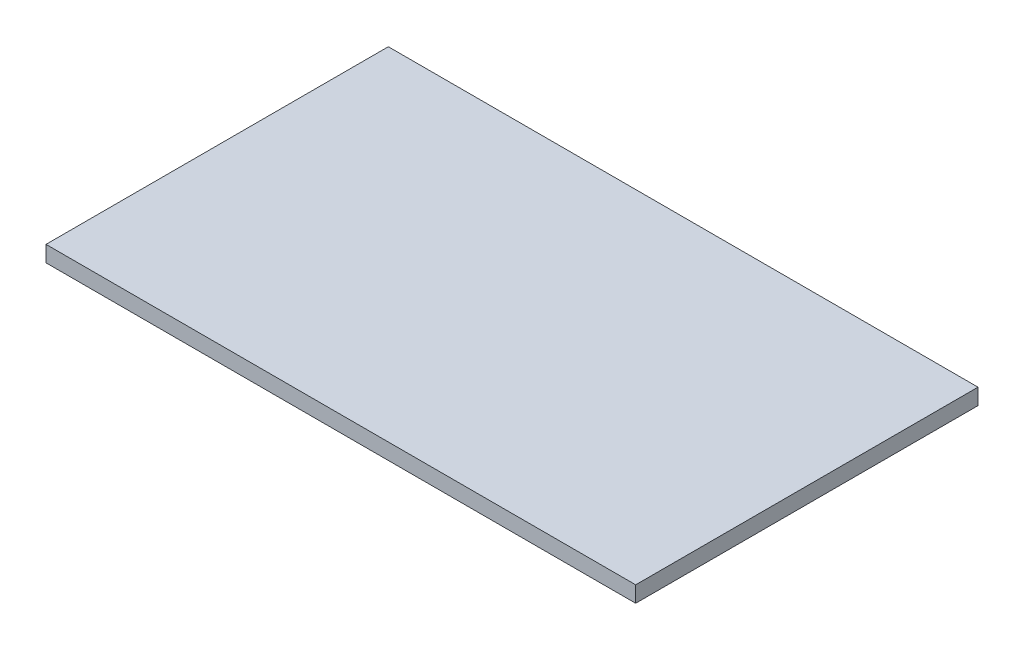
ISO-10303-21;
HEADER;
FILE_DESCRIPTION(('STEP AP214'),'2;1');
FILE_NAME('part.step','',(''),(''),'','','');
FILE_SCHEMA(('AUTOMOTIVE_DESIGN { 1 0 10303 214 1 1 1 1 }'));
ENDSEC;
DATA;
#1=APPLICATION_CONTEXT('core data for automotive mechanical design processes');
#2=APPLICATION_PROTOCOL_DEFINITION('international standard','automotive_design',2000,#1);
#3=PRODUCT_CONTEXT('',#1,'mechanical');
#4=PRODUCT('Part','Part','',(#3));
#5=PRODUCT_RELATED_PRODUCT_CATEGORY('part','',(#4));
#6=PRODUCT_DEFINITION_FORMATION('','',#4);
#7=PRODUCT_DEFINITION_CONTEXT('part definition',#1,'design');
#8=PRODUCT_DEFINITION('design','',#6,#7);
#9=PRODUCT_DEFINITION_SHAPE('','',#8);
#10=(LENGTH_UNIT() NAMED_UNIT(*) SI_UNIT(.MILLI.,.METRE.));
#11=(NAMED_UNIT(*) PLANE_ANGLE_UNIT() SI_UNIT($,.RADIAN.));
#12=(NAMED_UNIT(*) SI_UNIT($,.STERADIAN.) SOLID_ANGLE_UNIT());
#13=UNCERTAINTY_MEASURE_WITH_UNIT(LENGTH_MEASURE(1.E-05),#10,'distance_accuracy_value','');
#14=(GEOMETRIC_REPRESENTATION_CONTEXT(3) GLOBAL_UNCERTAINTY_ASSIGNED_CONTEXT((#13)) GLOBAL_UNIT_ASSIGNED_CONTEXT((#10,
#11,#12)) REPRESENTATION_CONTEXT('',''));
#15=CARTESIAN_POINT('',(0.,0.,0.));
#16=DIRECTION('',(0.,0.,1.));
#17=DIRECTION('',(1.,0.,0.));
#18=AXIS2_PLACEMENT_3D('',#15,#16,#17);
#19=CARTESIAN_POINT('',(0.,0.725,0.));
#20=DIRECTION('',(-1.,0.,0.));
#21=DIRECTION('',(0.,0.,1.));
#22=AXIS2_PLACEMENT_3D('',#19,#20,#21);
#23=PLANE('',#22);
#24=DIRECTION('',(0.,0.,-1.));
#25=VECTOR('',#24,1.);
#26=CARTESIAN_POINT('',(0.,0.,0.));
#27=LINE('',#26,#25);
#28=CARTESIAN_POINT('',(0.,0.,0.));
#29=VERTEX_POINT('',#28);
#30=CARTESIAN_POINT('',(0.,0.,-15.5));
#31=VERTEX_POINT('',#30);
#32=EDGE_CURVE('E97',#29,#31,#27,.T.);
#33=ORIENTED_EDGE('',*,*,#32,.T.);
#34=DIRECTION('',(0.,-1.,0.));
#35=VECTOR('',#34,1.);
#36=CARTESIAN_POINT('',(0.,0.725,-15.5));
#37=LINE('',#36,#35);
#38=CARTESIAN_POINT('',(0.,0.725,-15.5));
#39=VERTEX_POINT('',#38);
#40=EDGE_CURVE('E11',#39,#31,#37,.T.);
#41=ORIENTED_EDGE('',*,*,#40,.F.);
#42=DIRECTION('',(0.,0.,-1.));
#43=VECTOR('',#42,1.);
#44=CARTESIAN_POINT('',(0.,0.725,0.));
#45=LINE('',#44,#43);
#46=CARTESIAN_POINT('',(0.,0.725,0.));
#47=VERTEX_POINT('',#46);
#48=EDGE_CURVE('E85',#47,#39,#45,.T.);
#49=ORIENTED_EDGE('',*,*,#48,.F.);
#50=DIRECTION('',(0.,-1.,0.));
#51=VECTOR('',#50,1.);
#52=CARTESIAN_POINT('',(0.,0.725,0.));
#53=LINE('',#52,#51);
#54=EDGE_CURVE('E93',#47,#29,#53,.T.);
#55=ORIENTED_EDGE('',*,*,#54,.T.);
#56=EDGE_LOOP('',(#33,#41,#49,#55));
#57=FACE_BOUND('',#56,.T.);
#58=ADVANCED_FACE('F34',(#57),#23,.F.);
#59=CARTESIAN_POINT('',(0.,0.725,-15.5));
#60=DIRECTION('',(0.,0.,1.));
#61=DIRECTION('',(1.,0.,0.));
#62=AXIS2_PLACEMENT_3D('',#59,#60,#61);
#63=PLANE('',#62);
#64=DIRECTION('',(-1.,0.,0.));
#65=VECTOR('',#64,1.);
#66=CARTESIAN_POINT('',(0.,0.,-15.5));
#67=LINE('',#66,#65);
#68=CARTESIAN_POINT('',(-26.7,0.,-15.5));
#69=VERTEX_POINT('',#68);
#70=EDGE_CURVE('E89',#31,#69,#67,.T.);
#71=ORIENTED_EDGE('',*,*,#70,.T.);
#72=DIRECTION('',(0.,-1.,0.));
#73=VECTOR('',#72,1.);
#74=CARTESIAN_POINT('',(-26.7,0.725,-15.5));
#75=LINE('',#74,#73);
#76=CARTESIAN_POINT('',(-26.7,0.725,-15.5));
#77=VERTEX_POINT('',#76);
#78=EDGE_CURVE('E42',#77,#69,#75,.T.);
#79=ORIENTED_EDGE('',*,*,#78,.F.);
#80=DIRECTION('',(-1.,0.,0.));
#81=VECTOR('',#80,1.);
#82=CARTESIAN_POINT('',(0.,0.725,-15.5));
#83=LINE('',#82,#81);
#84=EDGE_CURVE('E80',#39,#77,#83,.T.);
#85=ORIENTED_EDGE('',*,*,#84,.F.);
#86=ORIENTED_EDGE('',*,*,#40,.T.);
#87=EDGE_LOOP('',(#71,#79,#85,#86));
#88=FACE_BOUND('',#87,.T.);
#89=ADVANCED_FACE('F88',(#88),#63,.F.);
#90=CARTESIAN_POINT('',(-26.7,0.725,0.));
#91=DIRECTION('',(1.,0.,0.));
#92=DIRECTION('',(0.,0.,-1.));
#93=AXIS2_PLACEMENT_3D('',#90,#91,#92);
#94=PLANE('',#93);
#95=DIRECTION('',(0.,0.,1.));
#96=VECTOR('',#95,1.);
#97=CARTESIAN_POINT('',(-26.7,0.,0.));
#98=LINE('',#97,#96);
#99=CARTESIAN_POINT('',(-26.7,0.,0.));
#100=VERTEX_POINT('',#99);
#101=EDGE_CURVE('E67',#69,#100,#98,.T.);
#102=ORIENTED_EDGE('',*,*,#101,.T.);
#103=DIRECTION('',(0.,-1.,0.));
#104=VECTOR('',#103,1.);
#105=CARTESIAN_POINT('',(-26.7,0.725,0.));
#106=LINE('',#105,#104);
#107=CARTESIAN_POINT('',(-26.7,0.725,0.));
#108=VERTEX_POINT('',#107);
#109=EDGE_CURVE('E90',#108,#100,#106,.T.);
#110=ORIENTED_EDGE('',*,*,#109,.F.);
#111=DIRECTION('',(0.,0.,1.));
#112=VECTOR('',#111,1.);
#113=CARTESIAN_POINT('',(-26.7,0.725,0.));
#114=LINE('',#113,#112);
#115=EDGE_CURVE('E83',#77,#108,#114,.T.);
#116=ORIENTED_EDGE('',*,*,#115,.F.);
#117=ORIENTED_EDGE('',*,*,#78,.T.);
#118=EDGE_LOOP('',(#102,#110,#116,#117));
#119=FACE_BOUND('',#118,.T.);
#120=ADVANCED_FACE('F91',(#119),#94,.F.);
#121=CARTESIAN_POINT('',(0.,0.725,0.));
#122=DIRECTION('',(0.,0.,-1.));
#123=DIRECTION('',(-1.,0.,0.));
#124=AXIS2_PLACEMENT_3D('',#121,#122,#123);
#125=PLANE('',#124);
#126=DIRECTION('',(1.,0.,0.));
#127=VECTOR('',#126,1.);
#128=CARTESIAN_POINT('',(0.,0.,0.));
#129=LINE('',#128,#127);
#130=EDGE_CURVE('E73',#100,#29,#129,.T.);
#131=ORIENTED_EDGE('',*,*,#130,.T.);
#132=ORIENTED_EDGE('',*,*,#54,.F.);
#133=DIRECTION('',(1.,0.,0.));
#134=VECTOR('',#133,1.);
#135=CARTESIAN_POINT('',(0.,0.725,0.));
#136=LINE('',#135,#134);
#137=EDGE_CURVE('E50',#108,#47,#136,.T.);
#138=ORIENTED_EDGE('',*,*,#137,.F.);
#139=ORIENTED_EDGE('',*,*,#109,.T.);
#140=EDGE_LOOP('',(#131,#132,#138,#139));
#141=FACE_BOUND('',#140,.T.);
#142=ADVANCED_FACE('F104',(#141),#125,.F.);
#143=CARTESIAN_POINT('',(0.,0.725,0.));
#144=DIRECTION('',(0.,1.,0.));
#145=DIRECTION('',(0.,0.,1.));
#146=AXIS2_PLACEMENT_3D('',#143,#144,#145);
#147=PLANE('',#146);
#148=ORIENTED_EDGE('',*,*,#48,.T.);
#149=ORIENTED_EDGE('',*,*,#84,.T.);
#150=ORIENTED_EDGE('',*,*,#115,.T.);
#151=ORIENTED_EDGE('',*,*,#137,.T.);
#152=EDGE_LOOP('',(#148,#149,#150,#151));
#153=FACE_BOUND('',#152,.T.);
#154=ADVANCED_FACE('F81',(#153),#147,.T.);
#155=CARTESIAN_POINT('',(0.,0.,0.));
#156=DIRECTION('',(0.,1.,0.));
#157=DIRECTION('',(0.,0.,1.));
#158=AXIS2_PLACEMENT_3D('',#155,#156,#157);
#159=PLANE('',#158);
#160=ORIENTED_EDGE('',*,*,#32,.F.);
#161=ORIENTED_EDGE('',*,*,#130,.F.);
#162=ORIENTED_EDGE('',*,*,#101,.F.);
#163=ORIENTED_EDGE('',*,*,#70,.F.);
#164=EDGE_LOOP('',(#160,#161,#162,#163));
#165=FACE_BOUND('',#164,.T.);
#166=ADVANCED_FACE('F107',(#165),#159,.F.);
#167=CLOSED_SHELL('',(#58,#89,#120,#142,#154,#166));
#168=MANIFOLD_SOLID_BREP('B2',#167);
#169=ADVANCED_BREP_SHAPE_REPRESENTATION('',(#18,#168),#14);
#170=SHAPE_DEFINITION_REPRESENTATION(#9,#169);
ENDSEC;
END-ISO-10303-21;
